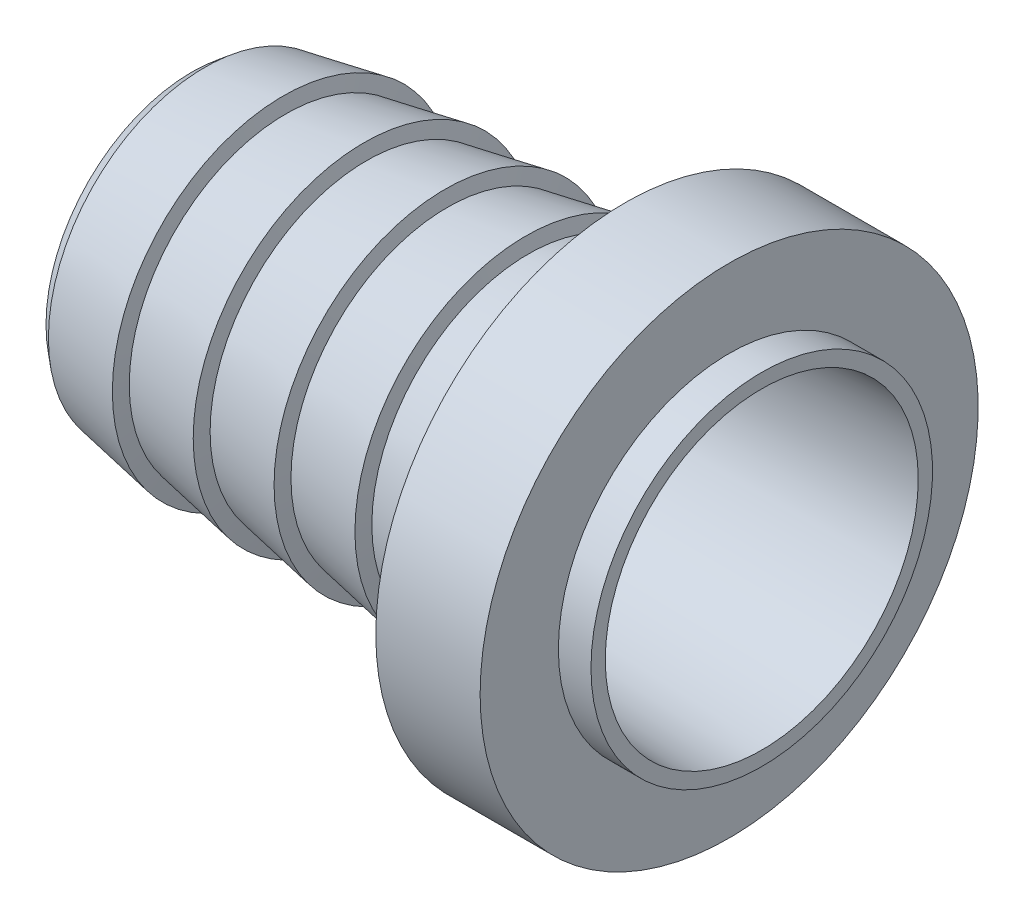
ISO-10303-21;
HEADER;
FILE_DESCRIPTION(('STEP AP214'),'2;1');
FILE_NAME('part.step','',(''),(''),'','','');
FILE_SCHEMA(('AUTOMOTIVE_DESIGN { 1 0 10303 214 1 1 1 1 }'));
ENDSEC;
DATA;
#1=APPLICATION_CONTEXT('core data for automotive mechanical design processes');
#2=APPLICATION_PROTOCOL_DEFINITION('international standard','automotive_design',2000,#1);
#3=PRODUCT_CONTEXT('',#1,'mechanical');
#4=PRODUCT('Part','Part','',(#3));
#5=PRODUCT_RELATED_PRODUCT_CATEGORY('part','',(#4));
#6=PRODUCT_DEFINITION_FORMATION('','',#4);
#7=PRODUCT_DEFINITION_CONTEXT('part definition',#1,'design');
#8=PRODUCT_DEFINITION('design','',#6,#7);
#9=PRODUCT_DEFINITION_SHAPE('','',#8);
#10=(LENGTH_UNIT() NAMED_UNIT(*) SI_UNIT(.MILLI.,.METRE.));
#11=(NAMED_UNIT(*) PLANE_ANGLE_UNIT() SI_UNIT($,.RADIAN.));
#12=(NAMED_UNIT(*) SI_UNIT($,.STERADIAN.) SOLID_ANGLE_UNIT());
#13=UNCERTAINTY_MEASURE_WITH_UNIT(LENGTH_MEASURE(1.E-05),#10,'distance_accuracy_value','');
#14=(GEOMETRIC_REPRESENTATION_CONTEXT(3) GLOBAL_UNCERTAINTY_ASSIGNED_CONTEXT((#13)) GLOBAL_UNIT_ASSIGNED_CONTEXT((#10,
#11,#12)) REPRESENTATION_CONTEXT('',''));
#15=CARTESIAN_POINT('',(0.,0.,0.));
#16=DIRECTION('',(0.,0.,1.));
#17=DIRECTION('',(1.,0.,0.));
#18=AXIS2_PLACEMENT_3D('',#15,#16,#17);
#19=CARTESIAN_POINT('',(0.,0.,0.));
#20=DIRECTION('',(1.,0.,0.));
#21=DIRECTION('',(0.,0.,-1.));
#22=AXIS2_PLACEMENT_3D('',#19,#20,#21);
#23=CONICAL_SURFACE('',#22,10.0954124925546,0.0435556741305435);
#24=CARTESIAN_POINT('',(43.6999999999999,0.,0.));
#25=DIRECTION('',(-1.,0.,0.));
#26=DIRECTION('',(0.,0.,1.));
#27=AXIS2_PLACEMENT_3D('',#24,#25,#26);
#28=CIRCLE('',#27,12.);
#29=CARTESIAN_POINT('',(43.6999999999999,0.,12.));
#30=VERTEX_POINT('',#29);
#31=EDGE_CURVE('E10',#30,#30,#28,.T.);
#32=ORIENTED_EDGE('',*,*,#31,.F.);
#33=EDGE_LOOP('',(#32));
#34=FACE_BOUND('',#33,.T.);
#35=CARTESIAN_POINT('',(0.,0.,0.));
#36=DIRECTION('',(-1.,0.,0.));
#37=DIRECTION('',(0.,0.,1.));
#38=AXIS2_PLACEMENT_3D('',#35,#36,#37);
#39=CIRCLE('',#38,10.0954124925546);
#40=CARTESIAN_POINT('',(0.,0.,10.0954124925546));
#41=VERTEX_POINT('',#40);
#42=EDGE_CURVE('E91',#41,#41,#39,.T.);
#43=ORIENTED_EDGE('',*,*,#42,.T.);
#44=EDGE_LOOP('',(#43));
#45=FACE_BOUND('',#44,.T.);
#46=ADVANCED_FACE('F33',(#34,#45),#23,.F.);
#47=CARTESIAN_POINT('',(43.6999999999999,0.,-12.));
#48=DIRECTION('',(-1.,0.,0.));
#49=DIRECTION('',(0.,0.,1.));
#50=AXIS2_PLACEMENT_3D('',#47,#48,#49);
#51=PLANE('',#50);
#52=CARTESIAN_POINT('',(43.6999999999999,0.,0.));
#53=DIRECTION('',(-1.,0.,0.));
#54=DIRECTION('',(0.,0.,1.));
#55=AXIS2_PLACEMENT_3D('',#52,#53,#54);
#56=CIRCLE('',#55,13.0954451150103);
#57=CARTESIAN_POINT('',(43.6999999999999,0.,13.0954451150103));
#58=VERTEX_POINT('',#57);
#59=EDGE_CURVE('E39',#58,#58,#56,.T.);
#60=ORIENTED_EDGE('',*,*,#59,.F.);
#61=EDGE_LOOP('',(#60));
#62=FACE_BOUND('',#61,.T.);
#63=ORIENTED_EDGE('',*,*,#31,.T.);
#64=EDGE_LOOP('',(#63));
#65=FACE_BOUND('',#64,.T.);
#66=ADVANCED_FACE('F188',(#62,#65),#51,.F.);
#67=CARTESIAN_POINT('',(0.,0.,0.));
#68=DIRECTION('',(-1.,0.,0.));
#69=DIRECTION('',(0.,0.,1.));
#70=AXIS2_PLACEMENT_3D('',#67,#68,#69);
#71=CYLINDRICAL_SURFACE('',#70,13.0954451150103);
#72=CARTESIAN_POINT('',(41.1999999999999,0.,0.));
#73=DIRECTION('',(-1.,0.,0.));
#74=DIRECTION('',(0.,0.,1.));
#75=AXIS2_PLACEMENT_3D('',#72,#73,#74);
#76=CIRCLE('',#75,13.0954451150103);
#77=CARTESIAN_POINT('',(41.1999999999999,0.,13.0954451150103));
#78=VERTEX_POINT('',#77);
#79=EDGE_CURVE('E43',#78,#78,#76,.T.);
#80=ORIENTED_EDGE('',*,*,#79,.F.);
#81=EDGE_LOOP('',(#80));
#82=FACE_BOUND('',#81,.T.);
#83=ORIENTED_EDGE('',*,*,#59,.T.);
#84=EDGE_LOOP('',(#83));
#85=FACE_BOUND('',#84,.T.);
#86=ADVANCED_FACE('F183',(#82,#85),#71,.T.);
#87=CARTESIAN_POINT('',(41.1999999999999,0.,-19.0954451150103));
#88=DIRECTION('',(-1.,0.,0.));
#89=DIRECTION('',(0.,0.,1.));
#90=AXIS2_PLACEMENT_3D('',#87,#88,#89);
#91=PLANE('',#90);
#92=CARTESIAN_POINT('',(41.1999999999999,0.,0.));
#93=DIRECTION('',(-1.,0.,0.));
#94=DIRECTION('',(0.,0.,1.));
#95=AXIS2_PLACEMENT_3D('',#92,#93,#94);
#96=CIRCLE('',#95,19.0954451150103);
#97=CARTESIAN_POINT('',(41.1999999999999,0.,19.0954451150103));
#98=VERTEX_POINT('',#97);
#99=EDGE_CURVE('E47',#98,#98,#96,.T.);
#100=ORIENTED_EDGE('',*,*,#99,.F.);
#101=EDGE_LOOP('',(#100));
#102=FACE_BOUND('',#101,.T.);
#103=ORIENTED_EDGE('',*,*,#79,.T.);
#104=EDGE_LOOP('',(#103));
#105=FACE_BOUND('',#104,.T.);
#106=ADVANCED_FACE('F177',(#102,#105),#91,.F.);
#107=CARTESIAN_POINT('',(0.,0.,0.));
#108=DIRECTION('',(-1.,0.,0.));
#109=DIRECTION('',(0.,0.,1.));
#110=AXIS2_PLACEMENT_3D('',#107,#108,#109);
#111=CYLINDRICAL_SURFACE('',#110,19.0954451150103);
#112=CARTESIAN_POINT('',(33.1999999999999,0.,0.));
#113=DIRECTION('',(-1.,0.,0.));
#114=DIRECTION('',(0.,0.,1.));
#115=AXIS2_PLACEMENT_3D('',#112,#113,#114);
#116=CIRCLE('',#115,19.0954451150103);
#117=CARTESIAN_POINT('',(33.1999999999999,0.,19.0954451150103));
#118=VERTEX_POINT('',#117);
#119=EDGE_CURVE('E52',#118,#118,#116,.T.);
#120=ORIENTED_EDGE('',*,*,#119,.F.);
#121=EDGE_LOOP('',(#120));
#122=FACE_BOUND('',#121,.T.);
#123=ORIENTED_EDGE('',*,*,#99,.T.);
#124=EDGE_LOOP('',(#123));
#125=FACE_BOUND('',#124,.T.);
#126=ADVANCED_FACE('F171',(#122,#125),#111,.T.);
#127=CARTESIAN_POINT('',(33.2,0.,-13.0954451150103));
#128=DIRECTION('',(1.,0.,0.));
#129=DIRECTION('',(0.,0.,-1.));
#130=AXIS2_PLACEMENT_3D('',#127,#128,#129);
#131=PLANE('',#130);
#132=CARTESIAN_POINT('',(33.2,0.,0.));
#133=DIRECTION('',(-1.,0.,0.));
#134=DIRECTION('',(0.,0.,1.));
#135=AXIS2_PLACEMENT_3D('',#132,#133,#134);
#136=CIRCLE('',#135,13.0954451150103);
#137=CARTESIAN_POINT('',(33.2,0.,13.0954451150103));
#138=VERTEX_POINT('',#137);
#139=EDGE_CURVE('E55',#138,#138,#136,.T.);
#140=ORIENTED_EDGE('',*,*,#139,.F.);
#141=EDGE_LOOP('',(#140));
#142=FACE_BOUND('',#141,.T.);
#143=ORIENTED_EDGE('',*,*,#119,.T.);
#144=EDGE_LOOP('',(#143));
#145=FACE_BOUND('',#144,.T.);
#146=ADVANCED_FACE('F165',(#142,#145),#131,.F.);
#147=CARTESIAN_POINT('',(0.,0.,0.));
#148=DIRECTION('',(-1.,0.,0.));
#149=DIRECTION('',(0.,0.,1.));
#150=AXIS2_PLACEMENT_3D('',#147,#148,#149);
#151=CYLINDRICAL_SURFACE('',#150,13.0954451150103);
#152=CARTESIAN_POINT('',(31.8,0.,0.));
#153=DIRECTION('',(-1.,0.,0.));
#154=DIRECTION('',(0.,0.,1.));
#155=AXIS2_PLACEMENT_3D('',#152,#153,#154);
#156=CIRCLE('',#155,13.0954451150103);
#157=CARTESIAN_POINT('',(31.8,0.,13.0954451150103));
#158=VERTEX_POINT('',#157);
#159=EDGE_CURVE('E58',#158,#158,#156,.T.);
#160=ORIENTED_EDGE('',*,*,#159,.F.);
#161=EDGE_LOOP('',(#160));
#162=FACE_BOUND('',#161,.T.);
#163=ORIENTED_EDGE('',*,*,#139,.T.);
#164=EDGE_LOOP('',(#163));
#165=FACE_BOUND('',#164,.T.);
#166=ADVANCED_FACE('F159',(#162,#165),#151,.T.);
#167=CARTESIAN_POINT('',(31.8,0.,0.));
#168=DIRECTION('',(1.,0.,0.));
#169=DIRECTION('',(0.,0.,-1.));
#170=AXIS2_PLACEMENT_3D('',#167,#168,#169);
#171=CONICAL_SURFACE('',#170,13.0954451150103,0.180585214190698);
#172=CARTESIAN_POINT('',(25.8,0.,0.));
#173=DIRECTION('',(-1.,0.,0.));
#174=DIRECTION('',(0.,0.,1.));
#175=AXIS2_PLACEMENT_3D('',#172,#173,#174);
#176=CIRCLE('',#175,12.);
#177=CARTESIAN_POINT('',(25.8,0.,12.));
#178=VERTEX_POINT('',#177);
#179=EDGE_CURVE('E61',#178,#178,#176,.T.);
#180=ORIENTED_EDGE('',*,*,#179,.F.);
#181=EDGE_LOOP('',(#180));
#182=FACE_BOUND('',#181,.T.);
#183=ORIENTED_EDGE('',*,*,#159,.T.);
#184=EDGE_LOOP('',(#183));
#185=FACE_BOUND('',#184,.T.);
#186=ADVANCED_FACE('F153',(#182,#185),#171,.T.);
#187=CARTESIAN_POINT('',(25.8,0.,0.));
#188=DIRECTION('',(-1.,0.,0.));
#189=DIRECTION('',(0.,0.,1.));
#190=AXIS2_PLACEMENT_3D('',#187,#188,#189);
#191=CONICAL_SURFACE('',#190,12.,1.39021111260421);
#192=CARTESIAN_POINT('',(25.6,0.,0.));
#193=DIRECTION('',(-1.,0.,0.));
#194=DIRECTION('',(0.,0.,1.));
#195=AXIS2_PLACEMENT_3D('',#192,#193,#194);
#196=CIRCLE('',#195,13.0954451150103);
#197=CARTESIAN_POINT('',(25.6,0.,13.0954451150103));
#198=VERTEX_POINT('',#197);
#199=EDGE_CURVE('E64',#198,#198,#196,.T.);
#200=ORIENTED_EDGE('',*,*,#199,.F.);
#201=EDGE_LOOP('',(#200));
#202=FACE_BOUND('',#201,.T.);
#203=ORIENTED_EDGE('',*,*,#179,.T.);
#204=EDGE_LOOP('',(#203));
#205=FACE_BOUND('',#204,.T.);
#206=ADVANCED_FACE('F147',(#202,#205),#191,.T.);
#207=CARTESIAN_POINT('',(25.6,0.,0.));
#208=DIRECTION('',(1.,0.,0.));
#209=DIRECTION('',(0.,0.,-1.));
#210=AXIS2_PLACEMENT_3D('',#207,#208,#209);
#211=CONICAL_SURFACE('',#210,13.0954451150103,0.180585214190698);
#212=CARTESIAN_POINT('',(19.6,0.,0.));
#213=DIRECTION('',(-1.,0.,0.));
#214=DIRECTION('',(0.,0.,1.));
#215=AXIS2_PLACEMENT_3D('',#212,#213,#214);
#216=CIRCLE('',#215,12.);
#217=CARTESIAN_POINT('',(19.6,0.,12.));
#218=VERTEX_POINT('',#217);
#219=EDGE_CURVE('E67',#218,#218,#216,.T.);
#220=ORIENTED_EDGE('',*,*,#219,.F.);
#221=EDGE_LOOP('',(#220));
#222=FACE_BOUND('',#221,.T.);
#223=ORIENTED_EDGE('',*,*,#199,.T.);
#224=EDGE_LOOP('',(#223));
#225=FACE_BOUND('',#224,.T.);
#226=ADVANCED_FACE('F141',(#222,#225),#211,.T.);
#227=CARTESIAN_POINT('',(19.6,0.,0.));
#228=DIRECTION('',(-1.,0.,0.));
#229=DIRECTION('',(0.,0.,1.));
#230=AXIS2_PLACEMENT_3D('',#227,#228,#229);
#231=CONICAL_SURFACE('',#230,12.,1.39021111260421);
#232=CARTESIAN_POINT('',(19.4,0.,0.));
#233=DIRECTION('',(-1.,0.,0.));
#234=DIRECTION('',(0.,0.,1.));
#235=AXIS2_PLACEMENT_3D('',#232,#233,#234);
#236=CIRCLE('',#235,13.0954451150103);
#237=CARTESIAN_POINT('',(19.4,0.,13.0954451150103));
#238=VERTEX_POINT('',#237);
#239=EDGE_CURVE('E70',#238,#238,#236,.T.);
#240=ORIENTED_EDGE('',*,*,#239,.F.);
#241=EDGE_LOOP('',(#240));
#242=FACE_BOUND('',#241,.T.);
#243=ORIENTED_EDGE('',*,*,#219,.T.);
#244=EDGE_LOOP('',(#243));
#245=FACE_BOUND('',#244,.T.);
#246=ADVANCED_FACE('F135',(#242,#245),#231,.T.);
#247=CARTESIAN_POINT('',(19.4,0.,0.));
#248=DIRECTION('',(1.,0.,0.));
#249=DIRECTION('',(0.,0.,-1.));
#250=AXIS2_PLACEMENT_3D('',#247,#248,#249);
#251=CONICAL_SURFACE('',#250,13.0954451150103,0.180585214190698);
#252=CARTESIAN_POINT('',(13.4,0.,0.));
#253=DIRECTION('',(-1.,0.,0.));
#254=DIRECTION('',(0.,0.,1.));
#255=AXIS2_PLACEMENT_3D('',#252,#253,#254);
#256=CIRCLE('',#255,12.);
#257=CARTESIAN_POINT('',(13.4,0.,12.));
#258=VERTEX_POINT('',#257);
#259=EDGE_CURVE('E73',#258,#258,#256,.T.);
#260=ORIENTED_EDGE('',*,*,#259,.F.);
#261=EDGE_LOOP('',(#260));
#262=FACE_BOUND('',#261,.T.);
#263=ORIENTED_EDGE('',*,*,#239,.T.);
#264=EDGE_LOOP('',(#263));
#265=FACE_BOUND('',#264,.T.);
#266=ADVANCED_FACE('F129',(#262,#265),#251,.T.);
#267=CARTESIAN_POINT('',(13.4,0.,0.));
#268=DIRECTION('',(-1.,0.,0.));
#269=DIRECTION('',(0.,0.,1.));
#270=AXIS2_PLACEMENT_3D('',#267,#268,#269);
#271=CONICAL_SURFACE('',#270,12.,1.39021111260421);
#272=CARTESIAN_POINT('',(13.2,0.,0.));
#273=DIRECTION('',(-1.,0.,0.));
#274=DIRECTION('',(0.,0.,1.));
#275=AXIS2_PLACEMENT_3D('',#272,#273,#274);
#276=CIRCLE('',#275,13.0954451150103);
#277=CARTESIAN_POINT('',(13.2,0.,13.0954451150103));
#278=VERTEX_POINT('',#277);
#279=EDGE_CURVE('E76',#278,#278,#276,.T.);
#280=ORIENTED_EDGE('',*,*,#279,.F.);
#281=EDGE_LOOP('',(#280));
#282=FACE_BOUND('',#281,.T.);
#283=ORIENTED_EDGE('',*,*,#259,.T.);
#284=EDGE_LOOP('',(#283));
#285=FACE_BOUND('',#284,.T.);
#286=ADVANCED_FACE('F123',(#282,#285),#271,.T.);
#287=CARTESIAN_POINT('',(13.2,0.,0.));
#288=DIRECTION('',(1.,0.,0.));
#289=DIRECTION('',(0.,0.,-1.));
#290=AXIS2_PLACEMENT_3D('',#287,#288,#289);
#291=CONICAL_SURFACE('',#290,13.0954451150103,0.180585214190698);
#292=CARTESIAN_POINT('',(7.2,0.,0.));
#293=DIRECTION('',(-1.,0.,0.));
#294=DIRECTION('',(0.,0.,1.));
#295=AXIS2_PLACEMENT_3D('',#292,#293,#294);
#296=CIRCLE('',#295,12.);
#297=CARTESIAN_POINT('',(7.2,0.,12.));
#298=VERTEX_POINT('',#297);
#299=EDGE_CURVE('E79',#298,#298,#296,.T.);
#300=ORIENTED_EDGE('',*,*,#299,.F.);
#301=EDGE_LOOP('',(#300));
#302=FACE_BOUND('',#301,.T.);
#303=ORIENTED_EDGE('',*,*,#279,.T.);
#304=EDGE_LOOP('',(#303));
#305=FACE_BOUND('',#304,.T.);
#306=ADVANCED_FACE('F117',(#302,#305),#291,.T.);
#307=CARTESIAN_POINT('',(7.2,0.,0.));
#308=DIRECTION('',(-1.,0.,0.));
#309=DIRECTION('',(0.,0.,1.));
#310=AXIS2_PLACEMENT_3D('',#307,#308,#309);
#311=CONICAL_SURFACE('',#310,12.,1.3902111126042);
#312=CARTESIAN_POINT('',(7.,0.,0.));
#313=DIRECTION('',(-1.,0.,0.));
#314=DIRECTION('',(0.,0.,1.));
#315=AXIS2_PLACEMENT_3D('',#312,#313,#314);
#316=CIRCLE('',#315,13.0954451150103);
#317=CARTESIAN_POINT('',(7.,0.,13.0954451150103));
#318=VERTEX_POINT('',#317);
#319=EDGE_CURVE('E82',#318,#318,#316,.T.);
#320=ORIENTED_EDGE('',*,*,#319,.F.);
#321=EDGE_LOOP('',(#320));
#322=FACE_BOUND('',#321,.T.);
#323=ORIENTED_EDGE('',*,*,#299,.T.);
#324=EDGE_LOOP('',(#323));
#325=FACE_BOUND('',#324,.T.);
#326=ADVANCED_FACE('F111',(#322,#325),#311,.T.);
#327=CARTESIAN_POINT('',(7.,0.,0.));
#328=DIRECTION('',(1.,0.,0.));
#329=DIRECTION('',(0.,0.,-1.));
#330=AXIS2_PLACEMENT_3D('',#327,#328,#329);
#331=CONICAL_SURFACE('',#330,13.0954451150103,0.180585214190698);
#332=CARTESIAN_POINT('',(1.,0.,0.));
#333=DIRECTION('',(-1.,0.,0.));
#334=DIRECTION('',(0.,0.,1.));
#335=AXIS2_PLACEMENT_3D('',#332,#333,#334);
#336=CIRCLE('',#335,12.);
#337=CARTESIAN_POINT('',(1.,0.,12.));
#338=VERTEX_POINT('',#337);
#339=EDGE_CURVE('E85',#338,#338,#336,.T.);
#340=ORIENTED_EDGE('',*,*,#339,.F.);
#341=EDGE_LOOP('',(#340));
#342=FACE_BOUND('',#341,.T.);
#343=ORIENTED_EDGE('',*,*,#319,.T.);
#344=EDGE_LOOP('',(#343));
#345=FACE_BOUND('',#344,.T.);
#346=ADVANCED_FACE('F105',(#342,#345),#331,.T.);
#347=CARTESIAN_POINT('',(1.,0.,0.));
#348=DIRECTION('',(1.,0.,0.));
#349=DIRECTION('',(0.,0.,-1.));
#350=AXIS2_PLACEMENT_3D('',#347,#348,#349);
#351=CONICAL_SURFACE('',#350,12.,0.684651816137485);
#352=CARTESIAN_POINT('',(0.,0.,0.));
#353=DIRECTION('',(-1.,0.,0.));
#354=DIRECTION('',(0.,0.,1.));
#355=AXIS2_PLACEMENT_3D('',#352,#353,#354);
#356=CIRCLE('',#355,11.1836157243346);
#357=CARTESIAN_POINT('',(0.,0.,11.1836157243346));
#358=VERTEX_POINT('',#357);
#359=EDGE_CURVE('E88',#358,#358,#356,.T.);
#360=ORIENTED_EDGE('',*,*,#359,.F.);
#361=EDGE_LOOP('',(#360));
#362=FACE_BOUND('',#361,.T.);
#363=ORIENTED_EDGE('',*,*,#339,.T.);
#364=EDGE_LOOP('',(#363));
#365=FACE_BOUND('',#364,.T.);
#366=ADVANCED_FACE('F99',(#362,#365),#351,.T.);
#367=CARTESIAN_POINT('',(0.,0.,-10.0954124925546));
#368=DIRECTION('',(1.,0.,0.));
#369=DIRECTION('',(0.,0.,-1.));
#370=AXIS2_PLACEMENT_3D('',#367,#368,#369);
#371=PLANE('',#370);
#372=ORIENTED_EDGE('',*,*,#42,.F.);
#373=EDGE_LOOP('',(#372));
#374=FACE_BOUND('',#373,.T.);
#375=ORIENTED_EDGE('',*,*,#359,.T.);
#376=EDGE_LOOP('',(#375));
#377=FACE_BOUND('',#376,.T.);
#378=ADVANCED_FACE('F96',(#374,#377),#371,.F.);
#379=CLOSED_SHELL('',(#46,#66,#86,#106,#126,#146,#166,#186,#206,#226,#246,#266,#286,#306,#326,
#346,#366,#378));
#380=MANIFOLD_SOLID_BREP('B2',#379);
#381=ADVANCED_BREP_SHAPE_REPRESENTATION('',(#18,#380),#14);
#382=SHAPE_DEFINITION_REPRESENTATION(#9,#381);
ENDSEC;
END-ISO-10303-21;
